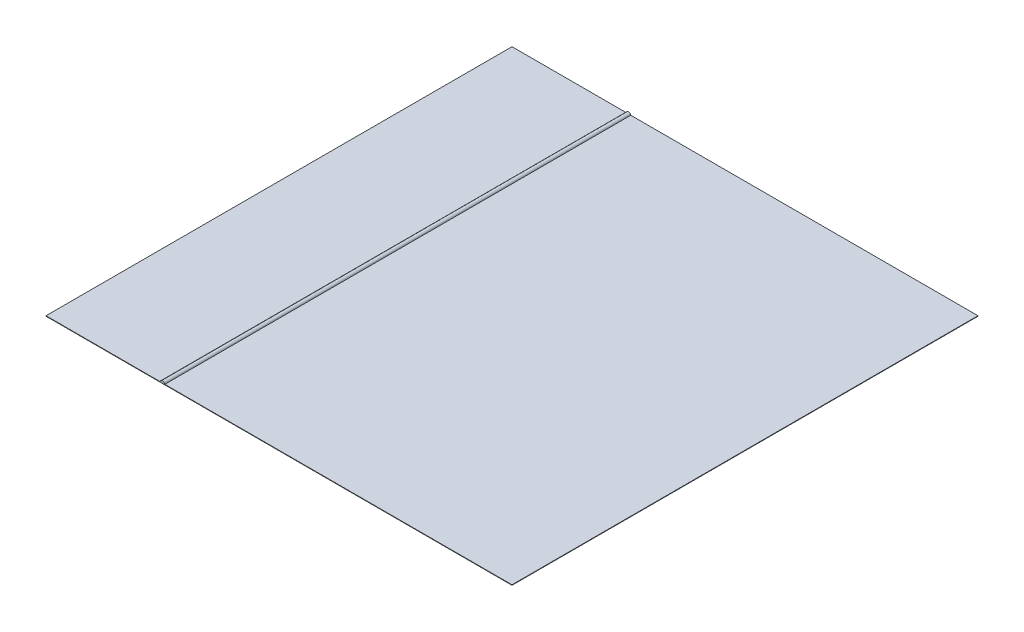
ISO-10303-21;
HEADER;
FILE_DESCRIPTION(('STEP AP214'),'2;1');
FILE_NAME('part.step','',(''),(''),'','','');
FILE_SCHEMA(('AUTOMOTIVE_DESIGN { 1 0 10303 214 1 1 1 1 }'));
ENDSEC;
DATA;
#1=APPLICATION_CONTEXT('core data for automotive mechanical design processes');
#2=APPLICATION_PROTOCOL_DEFINITION('international standard','automotive_design',2000,#1);
#3=PRODUCT_CONTEXT('',#1,'mechanical');
#4=PRODUCT('Part','Part','',(#3));
#5=PRODUCT_RELATED_PRODUCT_CATEGORY('part','',(#4));
#6=PRODUCT_DEFINITION_FORMATION('','',#4);
#7=PRODUCT_DEFINITION_CONTEXT('part definition',#1,'design');
#8=PRODUCT_DEFINITION('design','',#6,#7);
#9=PRODUCT_DEFINITION_SHAPE('','',#8);
#10=(LENGTH_UNIT() NAMED_UNIT(*) SI_UNIT(.MILLI.,.METRE.));
#11=(NAMED_UNIT(*) PLANE_ANGLE_UNIT() SI_UNIT($,.RADIAN.));
#12=(NAMED_UNIT(*) SI_UNIT($,.STERADIAN.) SOLID_ANGLE_UNIT());
#13=UNCERTAINTY_MEASURE_WITH_UNIT(LENGTH_MEASURE(1.E-05),#10,'distance_accuracy_value','');
#14=(GEOMETRIC_REPRESENTATION_CONTEXT(3) GLOBAL_UNCERTAINTY_ASSIGNED_CONTEXT((#13)) GLOBAL_UNIT_ASSIGNED_CONTEXT((#10,
#11,#12)) REPRESENTATION_CONTEXT('',''));
#15=CARTESIAN_POINT('',(0.,0.,0.));
#16=DIRECTION('',(0.,0.,1.));
#17=DIRECTION('',(1.,0.,0.));
#18=AXIS2_PLACEMENT_3D('',#15,#16,#17);
#19=CARTESIAN_POINT('',(0.,10.,0.));
#20=DIRECTION('',(0.,-1.,0.));
#21=DIRECTION('',(0.,0.,-1.));
#22=AXIS2_PLACEMENT_3D('',#19,#20,#21);
#23=PLANE('',#22);
#24=DIRECTION('',(-1.,0.,0.));
#25=VECTOR('',#24,1.);
#26=CARTESIAN_POINT('',(-5000.,10.,-5000.));
#27=LINE('',#26,#25);
#28=CARTESIAN_POINT('',(5000.,10.,-5000.));
#29=VERTEX_POINT('',#28);
#30=CARTESIAN_POINT('',(-2451.01020514434,10.,-5000.));
#31=VERTEX_POINT('',#30);
#32=EDGE_CURVE('E93',#29,#31,#27,.T.);
#33=ORIENTED_EDGE('',*,*,#32,.T.);
#34=DIRECTION('',(0.,0.,1.));
#35=VECTOR('',#34,1.);
#36=CARTESIAN_POINT('',(-2451.01020514434,10.,-5105.83005244259));
#37=LINE('',#36,#35);
#38=CARTESIAN_POINT('',(-2451.01020514434,10.,5000.));
#39=VERTEX_POINT('',#38);
#40=EDGE_CURVE('E48',#31,#39,#37,.T.);
#41=ORIENTED_EDGE('',*,*,#40,.T.);
#42=DIRECTION('',(1.,0.,0.));
#43=VECTOR('',#42,1.);
#44=CARTESIAN_POINT('',(-5000.,10.,5000.));
#45=LINE('',#44,#43);
#46=CARTESIAN_POINT('',(5000.,10.,5000.));
#47=VERTEX_POINT('',#46);
#48=EDGE_CURVE('E117',#39,#47,#45,.T.);
#49=ORIENTED_EDGE('',*,*,#48,.T.);
#50=DIRECTION('',(0.,0.,-1.));
#51=VECTOR('',#50,1.);
#52=CARTESIAN_POINT('',(5000.,10.,5000.));
#53=LINE('',#52,#51);
#54=EDGE_CURVE('E94',#47,#29,#53,.T.);
#55=ORIENTED_EDGE('',*,*,#54,.T.);
#56=EDGE_LOOP('',(#33,#41,#49,#55));
#57=FACE_BOUND('',#56,.T.);
#58=ADVANCED_FACE('F33',(#57),#23,.F.);
#59=CARTESIAN_POINT('',(5000.,10.,5000.));
#60=DIRECTION('',(-1.,0.,0.));
#61=DIRECTION('',(0.,0.,1.));
#62=AXIS2_PLACEMENT_3D('',#59,#60,#61);
#63=PLANE('',#62);
#64=DIRECTION('',(0.,0.,-1.));
#65=VECTOR('',#64,1.);
#66=CARTESIAN_POINT('',(5000.,0.,5000.));
#67=LINE('',#66,#65);
#68=CARTESIAN_POINT('',(5000.,0.,5000.));
#69=VERTEX_POINT('',#68);
#70=CARTESIAN_POINT('',(5000.,0.,-5000.));
#71=VERTEX_POINT('',#70);
#72=EDGE_CURVE('E104',#69,#71,#67,.T.);
#73=ORIENTED_EDGE('',*,*,#72,.T.);
#74=DIRECTION('',(0.,-1.,0.));
#75=VECTOR('',#74,1.);
#76=CARTESIAN_POINT('',(5000.,10.,-5000.));
#77=LINE('',#76,#75);
#78=EDGE_CURVE('E11',#29,#71,#77,.T.);
#79=ORIENTED_EDGE('',*,*,#78,.F.);
#80=ORIENTED_EDGE('',*,*,#54,.F.);
#81=DIRECTION('',(0.,-1.,0.));
#82=VECTOR('',#81,1.);
#83=CARTESIAN_POINT('',(5000.,10.,5000.));
#84=LINE('',#83,#82);
#85=EDGE_CURVE('E118',#47,#69,#84,.T.);
#86=ORIENTED_EDGE('',*,*,#85,.T.);
#87=EDGE_LOOP('',(#73,#79,#80,#86));
#88=FACE_BOUND('',#87,.T.);
#89=ADVANCED_FACE('F35',(#88),#63,.F.);
#90=CARTESIAN_POINT('',(-5000.,10.,-5000.));
#91=DIRECTION('',(0.,0.,1.));
#92=DIRECTION('',(1.,0.,0.));
#93=AXIS2_PLACEMENT_3D('',#90,#91,#92);
#94=PLANE('',#93);
#95=DIRECTION('',(-1.,0.,0.));
#96=VECTOR('',#95,1.);
#97=CARTESIAN_POINT('',(-5000.,0.,-5000.));
#98=LINE('',#97,#96);
#99=CARTESIAN_POINT('',(-5000.,0.,-5000.));
#100=VERTEX_POINT('',#99);
#101=EDGE_CURVE('E107',#71,#100,#98,.T.);
#102=ORIENTED_EDGE('',*,*,#101,.T.);
#103=DIRECTION('',(0.,-1.,0.));
#104=VECTOR('',#103,1.);
#105=CARTESIAN_POINT('',(-5000.,10.,-5000.));
#106=LINE('',#105,#104);
#107=CARTESIAN_POINT('',(-5000.,10.,-5000.));
#108=VERTEX_POINT('',#107);
#109=EDGE_CURVE('E41',#108,#100,#106,.T.);
#110=ORIENTED_EDGE('',*,*,#109,.F.);
#111=CARTESIAN_POINT('',(-2548.98979485566,10.,-5000.));
#112=VERTEX_POINT('',#111);
#113=EDGE_CURVE('E87',#112,#108,#27,.T.);
#114=ORIENTED_EDGE('',*,*,#113,.F.);
#115=CARTESIAN_POINT('',(-2500.,0.,-5000.));
#116=DIRECTION('',(0.,0.,1.));
#117=DIRECTION('',(1.,0.,0.));
#118=AXIS2_PLACEMENT_3D('',#115,#116,#117);
#119=CIRCLE('',#118,50.0000000000001);
#120=EDGE_CURVE('E90',#112,#31,#119,.F.);
#121=ORIENTED_EDGE('',*,*,#120,.T.);
#122=ORIENTED_EDGE('',*,*,#32,.F.);
#123=ORIENTED_EDGE('',*,*,#78,.T.);
#124=EDGE_LOOP('',(#102,#110,#114,#121,#122,#123));
#125=FACE_BOUND('',#124,.T.);
#126=ADVANCED_FACE('F88',(#125),#94,.F.);
#127=CARTESIAN_POINT('',(-5000.,10.,5000.));
#128=DIRECTION('',(1.,0.,0.));
#129=DIRECTION('',(0.,0.,-1.));
#130=AXIS2_PLACEMENT_3D('',#127,#128,#129);
#131=PLANE('',#130);
#132=DIRECTION('',(0.,0.,1.));
#133=VECTOR('',#132,1.);
#134=CARTESIAN_POINT('',(-5000.,0.,5000.));
#135=LINE('',#134,#133);
#136=CARTESIAN_POINT('',(-5000.,0.,5000.));
#137=VERTEX_POINT('',#136);
#138=EDGE_CURVE('E121',#100,#137,#135,.T.);
#139=ORIENTED_EDGE('',*,*,#138,.T.);
#140=DIRECTION('',(0.,-1.,0.));
#141=VECTOR('',#140,1.);
#142=CARTESIAN_POINT('',(-5000.,10.,5000.));
#143=LINE('',#142,#141);
#144=CARTESIAN_POINT('',(-5000.,10.,5000.));
#145=VERTEX_POINT('',#144);
#146=EDGE_CURVE('E126',#145,#137,#143,.T.);
#147=ORIENTED_EDGE('',*,*,#146,.F.);
#148=DIRECTION('',(0.,0.,1.));
#149=VECTOR('',#148,1.);
#150=CARTESIAN_POINT('',(-5000.,10.,5000.));
#151=LINE('',#150,#149);
#152=EDGE_CURVE('E115',#108,#145,#151,.T.);
#153=ORIENTED_EDGE('',*,*,#152,.F.);
#154=ORIENTED_EDGE('',*,*,#109,.T.);
#155=EDGE_LOOP('',(#139,#147,#153,#154));
#156=FACE_BOUND('',#155,.T.);
#157=ADVANCED_FACE('F130',(#156),#131,.F.);
#158=CARTESIAN_POINT('',(-5000.,10.,5000.));
#159=DIRECTION('',(0.,0.,-1.));
#160=DIRECTION('',(-1.,0.,0.));
#161=AXIS2_PLACEMENT_3D('',#158,#159,#160);
#162=PLANE('',#161);
#163=DIRECTION('',(1.,0.,0.));
#164=VECTOR('',#163,1.);
#165=CARTESIAN_POINT('',(-5000.,0.,5000.));
#166=LINE('',#165,#164);
#167=EDGE_CURVE('E113',#137,#69,#166,.T.);
#168=ORIENTED_EDGE('',*,*,#167,.T.);
#169=ORIENTED_EDGE('',*,*,#85,.F.);
#170=ORIENTED_EDGE('',*,*,#48,.F.);
#171=CARTESIAN_POINT('',(-2500.,0.,5000.));
#172=DIRECTION('',(0.,0.,1.));
#173=DIRECTION('',(1.,0.,0.));
#174=AXIS2_PLACEMENT_3D('',#171,#172,#173);
#175=CIRCLE('',#174,50.0000000000001);
#176=CARTESIAN_POINT('',(-2548.98979485566,10.,5000.));
#177=VERTEX_POINT('',#176);
#178=EDGE_CURVE('E101',#39,#177,#175,.T.);
#179=ORIENTED_EDGE('',*,*,#178,.T.);
#180=EDGE_CURVE('E56',#145,#177,#45,.T.);
#181=ORIENTED_EDGE('',*,*,#180,.F.);
#182=ORIENTED_EDGE('',*,*,#146,.T.);
#183=EDGE_LOOP('',(#168,#169,#170,#179,#181,#182));
#184=FACE_BOUND('',#183,.T.);
#185=ADVANCED_FACE('F138',(#184),#162,.F.);
#186=ORIENTED_EDGE('',*,*,#180,.T.);
#187=DIRECTION('',(0.,0.,1.));
#188=VECTOR('',#187,1.);
#189=CARTESIAN_POINT('',(-2548.98979485566,10.,-5105.83005244259));
#190=LINE('',#189,#188);
#191=EDGE_CURVE('E96',#112,#177,#190,.T.);
#192=ORIENTED_EDGE('',*,*,#191,.F.);
#193=ORIENTED_EDGE('',*,*,#113,.T.);
#194=ORIENTED_EDGE('',*,*,#152,.T.);
#195=EDGE_LOOP('',(#186,#192,#193,#194));
#196=FACE_BOUND('',#195,.T.);
#197=ADVANCED_FACE('F97',(#196),#23,.F.);
#198=CARTESIAN_POINT('',(0.,0.,0.));
#199=DIRECTION('',(0.,-1.,0.));
#200=DIRECTION('',(0.,0.,-1.));
#201=AXIS2_PLACEMENT_3D('',#198,#199,#200);
#202=PLANE('',#201);
#203=ORIENTED_EDGE('',*,*,#72,.F.);
#204=ORIENTED_EDGE('',*,*,#167,.F.);
#205=ORIENTED_EDGE('',*,*,#138,.F.);
#206=ORIENTED_EDGE('',*,*,#101,.F.);
#207=EDGE_LOOP('',(#203,#204,#205,#206));
#208=FACE_BOUND('',#207,.T.);
#209=ADVANCED_FACE('F135',(#208),#202,.T.);
#210=CARTESIAN_POINT('',(-2500.,0.,-5105.83005244259));
#211=DIRECTION('',(0.,0.,1.));
#212=DIRECTION('',(1.,0.,0.));
#213=AXIS2_PLACEMENT_3D('',#210,#211,#212);
#214=CYLINDRICAL_SURFACE('',#213,50.0000000000001);
#215=ORIENTED_EDGE('',*,*,#120,.F.);
#216=ORIENTED_EDGE('',*,*,#191,.T.);
#217=ORIENTED_EDGE('',*,*,#178,.F.);
#218=ORIENTED_EDGE('',*,*,#40,.F.);
#219=EDGE_LOOP('',(#215,#216,#217,#218));
#220=FACE_BOUND('',#219,.T.);
#221=ADVANCED_FACE('F103',(#220),#214,.T.);
#222=CLOSED_SHELL('',(#58,#89,#126,#157,#185,#197,#209,#221));
#223=MANIFOLD_SOLID_BREP('B2',#222);
#224=ADVANCED_BREP_SHAPE_REPRESENTATION('',(#18,#223),#14);
#225=SHAPE_DEFINITION_REPRESENTATION(#9,#224);
ENDSEC;
END-ISO-10303-21;
